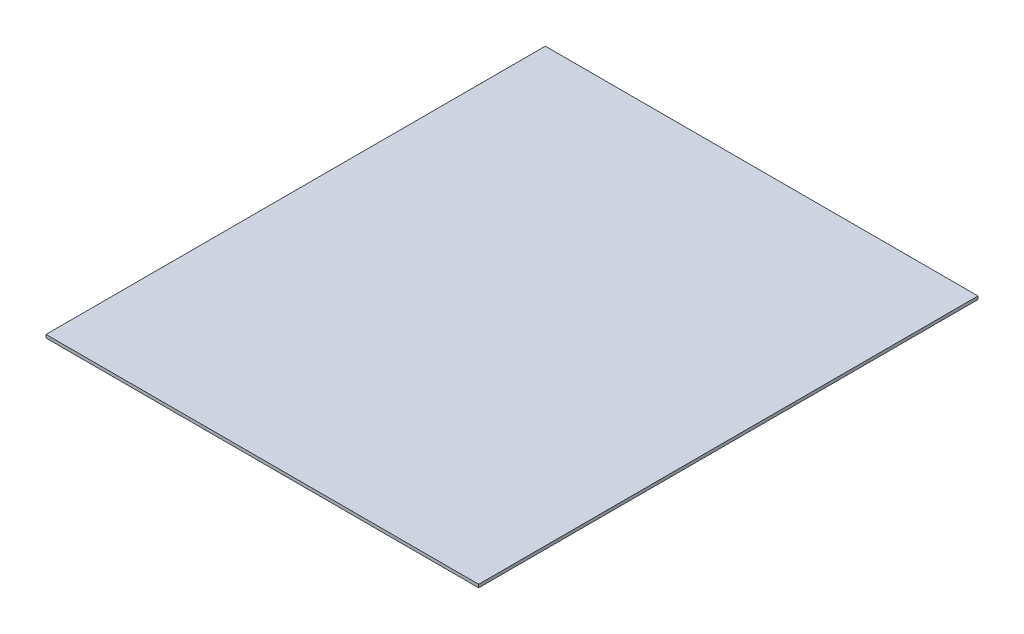
ISO-10303-21;
HEADER;
FILE_DESCRIPTION(('STEP AP214'),'2;1');
FILE_NAME('part.step','',(''),(''),'','','');
FILE_SCHEMA(('AUTOMOTIVE_DESIGN { 1 0 10303 214 1 1 1 1 }'));
ENDSEC;
DATA;
#1=APPLICATION_CONTEXT('core data for automotive mechanical design processes');
#2=APPLICATION_PROTOCOL_DEFINITION('international standard','automotive_design',2000,#1);
#3=PRODUCT_CONTEXT('',#1,'mechanical');
#4=PRODUCT('Part','Part','',(#3));
#5=PRODUCT_RELATED_PRODUCT_CATEGORY('part','',(#4));
#6=PRODUCT_DEFINITION_FORMATION('','',#4);
#7=PRODUCT_DEFINITION_CONTEXT('part definition',#1,'design');
#8=PRODUCT_DEFINITION('design','',#6,#7);
#9=PRODUCT_DEFINITION_SHAPE('','',#8);
#10=(LENGTH_UNIT() NAMED_UNIT(*) SI_UNIT(.MILLI.,.METRE.));
#11=(NAMED_UNIT(*) PLANE_ANGLE_UNIT() SI_UNIT($,.RADIAN.));
#12=(NAMED_UNIT(*) SI_UNIT($,.STERADIAN.) SOLID_ANGLE_UNIT());
#13=UNCERTAINTY_MEASURE_WITH_UNIT(LENGTH_MEASURE(1.E-05),#10,'distance_accuracy_value','');
#14=(GEOMETRIC_REPRESENTATION_CONTEXT(3) GLOBAL_UNCERTAINTY_ASSIGNED_CONTEXT((#13)) GLOBAL_UNIT_ASSIGNED_CONTEXT((#10,
#11,#12)) REPRESENTATION_CONTEXT('',''));
#15=CARTESIAN_POINT('',(0.,0.,0.));
#16=DIRECTION('',(0.,0.,1.));
#17=DIRECTION('',(1.,0.,0.));
#18=AXIS2_PLACEMENT_3D('',#15,#16,#17);
#19=CARTESIAN_POINT('',(138.65,2.,-160.));
#20=DIRECTION('',(-1.,0.,0.));
#21=DIRECTION('',(0.,0.,1.));
#22=AXIS2_PLACEMENT_3D('',#19,#20,#21);
#23=PLANE('',#22);
#24=DIRECTION('',(0.,0.,-1.));
#25=VECTOR('',#24,1.);
#26=CARTESIAN_POINT('',(138.65,0.,-160.));
#27=LINE('',#26,#25);
#28=CARTESIAN_POINT('',(138.65,0.,160.));
#29=VERTEX_POINT('',#28);
#30=CARTESIAN_POINT('',(138.65,0.,-160.));
#31=VERTEX_POINT('',#30);
#32=EDGE_CURVE('E107',#29,#31,#27,.T.);
#33=ORIENTED_EDGE('',*,*,#32,.T.);
#34=DIRECTION('',(0.,-1.,0.));
#35=VECTOR('',#34,1.);
#36=CARTESIAN_POINT('',(138.65,2.,-160.));
#37=LINE('',#36,#35);
#38=CARTESIAN_POINT('',(138.65,2.,-160.));
#39=VERTEX_POINT('',#38);
#40=EDGE_CURVE('E11',#39,#31,#37,.T.);
#41=ORIENTED_EDGE('',*,*,#40,.F.);
#42=DIRECTION('',(0.,0.,-1.));
#43=VECTOR('',#42,1.);
#44=CARTESIAN_POINT('',(138.65,2.,-160.));
#45=LINE('',#44,#43);
#46=CARTESIAN_POINT('',(138.65,2.,160.));
#47=VERTEX_POINT('',#46);
#48=EDGE_CURVE('E91',#47,#39,#45,.T.);
#49=ORIENTED_EDGE('',*,*,#48,.F.);
#50=DIRECTION('',(0.,-1.,0.));
#51=VECTOR('',#50,1.);
#52=CARTESIAN_POINT('',(138.65,2.,160.));
#53=LINE('',#52,#51);
#54=EDGE_CURVE('E103',#47,#29,#53,.T.);
#55=ORIENTED_EDGE('',*,*,#54,.T.);
#56=EDGE_LOOP('',(#33,#41,#49,#55));
#57=FACE_BOUND('',#56,.T.);
#58=ADVANCED_FACE('F39',(#57),#23,.F.);
#59=CARTESIAN_POINT('',(-138.65,2.,-160.));
#60=DIRECTION('',(0.,0.,1.));
#61=DIRECTION('',(1.,0.,0.));
#62=AXIS2_PLACEMENT_3D('',#59,#60,#61);
#63=PLANE('',#62);
#64=DIRECTION('',(-1.,0.,0.));
#65=VECTOR('',#64,1.);
#66=CARTESIAN_POINT('',(-138.65,0.,-160.));
#67=LINE('',#66,#65);
#68=CARTESIAN_POINT('',(-138.65,0.,-160.));
#69=VERTEX_POINT('',#68);
#70=EDGE_CURVE('E96',#31,#69,#67,.T.);
#71=ORIENTED_EDGE('',*,*,#70,.T.);
#72=DIRECTION('',(0.,-1.,0.));
#73=VECTOR('',#72,1.);
#74=CARTESIAN_POINT('',(-138.65,2.,-160.));
#75=LINE('',#74,#73);
#76=CARTESIAN_POINT('',(-138.65,2.,-160.));
#77=VERTEX_POINT('',#76);
#78=EDGE_CURVE('E48',#77,#69,#75,.T.);
#79=ORIENTED_EDGE('',*,*,#78,.F.);
#80=DIRECTION('',(-1.,0.,0.));
#81=VECTOR('',#80,1.);
#82=CARTESIAN_POINT('',(-138.65,2.,-160.));
#83=LINE('',#82,#81);
#84=EDGE_CURVE('E86',#39,#77,#83,.T.);
#85=ORIENTED_EDGE('',*,*,#84,.F.);
#86=ORIENTED_EDGE('',*,*,#40,.T.);
#87=EDGE_LOOP('',(#71,#79,#85,#86));
#88=FACE_BOUND('',#87,.T.);
#89=ADVANCED_FACE('F95',(#88),#63,.F.);
#90=CARTESIAN_POINT('',(-138.65,2.,-160.));
#91=DIRECTION('',(1.,0.,0.));
#92=DIRECTION('',(0.,0.,-1.));
#93=AXIS2_PLACEMENT_3D('',#90,#91,#92);
#94=PLANE('',#93);
#95=DIRECTION('',(0.,0.,1.));
#96=VECTOR('',#95,1.);
#97=CARTESIAN_POINT('',(-138.65,0.,-160.));
#98=LINE('',#97,#96);
#99=CARTESIAN_POINT('',(-138.65,0.,160.));
#100=VERTEX_POINT('',#99);
#101=EDGE_CURVE('E73',#69,#100,#98,.T.);
#102=ORIENTED_EDGE('',*,*,#101,.T.);
#103=DIRECTION('',(0.,-1.,0.));
#104=VECTOR('',#103,1.);
#105=CARTESIAN_POINT('',(-138.65,2.,160.));
#106=LINE('',#105,#104);
#107=CARTESIAN_POINT('',(-138.65,2.,160.));
#108=VERTEX_POINT('',#107);
#109=EDGE_CURVE('E98',#108,#100,#106,.T.);
#110=ORIENTED_EDGE('',*,*,#109,.F.);
#111=DIRECTION('',(0.,0.,1.));
#112=VECTOR('',#111,1.);
#113=CARTESIAN_POINT('',(-138.65,2.,-160.));
#114=LINE('',#113,#112);
#115=EDGE_CURVE('E89',#77,#108,#114,.T.);
#116=ORIENTED_EDGE('',*,*,#115,.F.);
#117=ORIENTED_EDGE('',*,*,#78,.T.);
#118=EDGE_LOOP('',(#102,#110,#116,#117));
#119=FACE_BOUND('',#118,.T.);
#120=ADVANCED_FACE('F99',(#119),#94,.F.);
#121=CARTESIAN_POINT('',(-138.65,2.,160.));
#122=DIRECTION('',(0.,0.,-1.));
#123=DIRECTION('',(-1.,0.,0.));
#124=AXIS2_PLACEMENT_3D('',#121,#122,#123);
#125=PLANE('',#124);
#126=DIRECTION('',(1.,0.,0.));
#127=VECTOR('',#126,1.);
#128=CARTESIAN_POINT('',(-138.65,0.,160.));
#129=LINE('',#128,#127);
#130=EDGE_CURVE('E79',#100,#29,#129,.T.);
#131=ORIENTED_EDGE('',*,*,#130,.T.);
#132=ORIENTED_EDGE('',*,*,#54,.F.);
#133=DIRECTION('',(1.,0.,0.));
#134=VECTOR('',#133,1.);
#135=CARTESIAN_POINT('',(-138.65,2.,160.));
#136=LINE('',#135,#134);
#137=EDGE_CURVE('E56',#108,#47,#136,.T.);
#138=ORIENTED_EDGE('',*,*,#137,.F.);
#139=ORIENTED_EDGE('',*,*,#109,.T.);
#140=EDGE_LOOP('',(#131,#132,#138,#139));
#141=FACE_BOUND('',#140,.T.);
#142=ADVANCED_FACE('F120',(#141),#125,.F.);
#143=CARTESIAN_POINT('',(0.,2.,0.));
#144=DIRECTION('',(0.,1.,0.));
#145=DIRECTION('',(0.,0.,1.));
#146=AXIS2_PLACEMENT_3D('',#143,#144,#145);
#147=PLANE('',#146);
#148=ORIENTED_EDGE('',*,*,#48,.T.);
#149=ORIENTED_EDGE('',*,*,#84,.T.);
#150=ORIENTED_EDGE('',*,*,#115,.T.);
#151=ORIENTED_EDGE('',*,*,#137,.T.);
#152=EDGE_LOOP('',(#148,#149,#150,#151));
#153=FACE_BOUND('',#152,.T.);
#154=ADVANCED_FACE('F87',(#153),#147,.T.);
#155=CARTESIAN_POINT('',(0.,0.,0.));
#156=DIRECTION('',(0.,1.,0.));
#157=DIRECTION('',(0.,0.,1.));
#158=AXIS2_PLACEMENT_3D('',#155,#156,#157);
#159=PLANE('',#158);
#160=ORIENTED_EDGE('',*,*,#32,.F.);
#161=ORIENTED_EDGE('',*,*,#130,.F.);
#162=ORIENTED_EDGE('',*,*,#101,.F.);
#163=ORIENTED_EDGE('',*,*,#70,.F.);
#164=EDGE_LOOP('',(#160,#161,#162,#163));
#165=FACE_BOUND('',#164,.T.);
#166=ADVANCED_FACE('F123',(#165),#159,.F.);
#167=CLOSED_SHELL('',(#58,#89,#120,#142,#154,#166));
#168=MANIFOLD_SOLID_BREP('B2',#167);
#169=ADVANCED_BREP_SHAPE_REPRESENTATION('',(#18,#168),#14);
#170=SHAPE_DEFINITION_REPRESENTATION(#9,#169);
ENDSEC;
END-ISO-10303-21;
